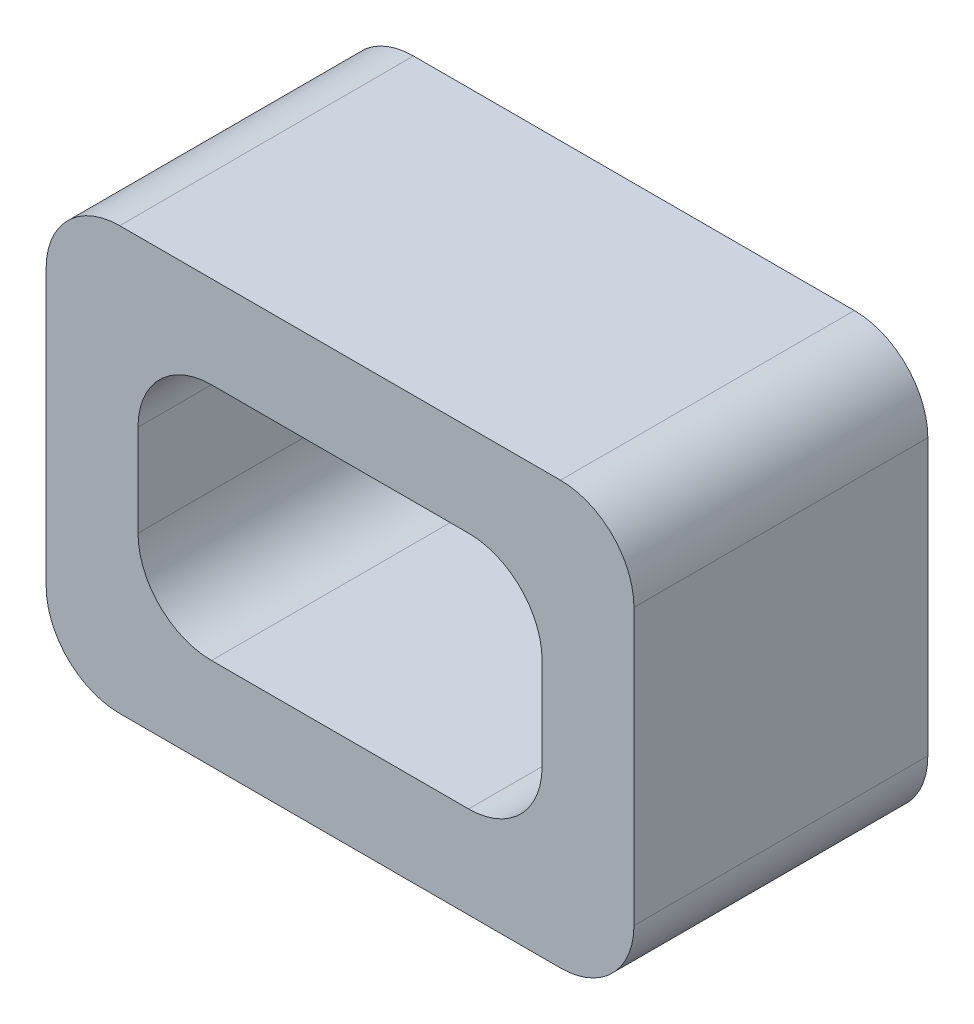
ISO-10303-21;
HEADER;
FILE_DESCRIPTION(('STEP AP214'),'2;1');
FILE_NAME('part.step','',(''),(''),'','','');
FILE_SCHEMA(('AUTOMOTIVE_DESIGN { 1 0 10303 214 1 1 1 1 }'));
ENDSEC;
DATA;
#1=APPLICATION_CONTEXT('core data for automotive mechanical design processes');
#2=APPLICATION_PROTOCOL_DEFINITION('international standard','automotive_design',2000,#1);
#3=PRODUCT_CONTEXT('',#1,'mechanical');
#4=PRODUCT('Part','Part','',(#3));
#5=PRODUCT_RELATED_PRODUCT_CATEGORY('part','',(#4));
#6=PRODUCT_DEFINITION_FORMATION('','',#4);
#7=PRODUCT_DEFINITION_CONTEXT('part definition',#1,'design');
#8=PRODUCT_DEFINITION('design','',#6,#7);
#9=PRODUCT_DEFINITION_SHAPE('','',#8);
#10=(LENGTH_UNIT() NAMED_UNIT(*) SI_UNIT(.MILLI.,.METRE.));
#11=(NAMED_UNIT(*) PLANE_ANGLE_UNIT() SI_UNIT($,.RADIAN.));
#12=(NAMED_UNIT(*) SI_UNIT($,.STERADIAN.) SOLID_ANGLE_UNIT());
#13=UNCERTAINTY_MEASURE_WITH_UNIT(LENGTH_MEASURE(1.E-05),#10,'distance_accuracy_value','');
#14=(GEOMETRIC_REPRESENTATION_CONTEXT(3) GLOBAL_UNCERTAINTY_ASSIGNED_CONTEXT((#13)) GLOBAL_UNIT_ASSIGNED_CONTEXT((#10,
#11,#12)) REPRESENTATION_CONTEXT('',''));
#15=CARTESIAN_POINT('',(0.,0.,0.));
#16=DIRECTION('',(0.,0.,1.));
#17=DIRECTION('',(1.,0.,0.));
#18=AXIS2_PLACEMENT_3D('',#15,#16,#17);
#19=CARTESIAN_POINT('',(0.,0.,0.8));
#20=DIRECTION('',(-1.,0.,0.));
#21=DIRECTION('',(0.,0.,1.));
#22=AXIS2_PLACEMENT_3D('',#19,#20,#21);
#23=PLANE('',#22);
#24=DIRECTION('',(0.,1.,0.));
#25=VECTOR('',#24,1.);
#26=CARTESIAN_POINT('',(0.,0.,0.8));
#27=LINE('',#26,#25);
#28=CARTESIAN_POINT('',(0.,0.2,0.8));
#29=VERTEX_POINT('',#28);
#30=CARTESIAN_POINT('',(0.,0.95,0.8));
#31=VERTEX_POINT('',#30);
#32=EDGE_CURVE('E174',#29,#31,#27,.T.);
#33=ORIENTED_EDGE('',*,*,#32,.F.);
#34=DIRECTION('',(0.,0.,-1.));
#35=VECTOR('',#34,1.);
#36=CARTESIAN_POINT('',(0.,0.2,0.8));
#37=LINE('',#36,#35);
#38=CARTESIAN_POINT('',(0.,0.2,0.));
#39=VERTEX_POINT('',#38);
#40=EDGE_CURVE('E206',#29,#39,#37,.T.);
#41=ORIENTED_EDGE('',*,*,#40,.T.);
#42=DIRECTION('',(0.,1.,0.));
#43=VECTOR('',#42,1.);
#44=CARTESIAN_POINT('',(0.,0.,0.));
#45=LINE('',#44,#43);
#46=CARTESIAN_POINT('',(0.,0.95,0.));
#47=VERTEX_POINT('',#46);
#48=EDGE_CURVE('E265',#39,#47,#45,.T.);
#49=ORIENTED_EDGE('',*,*,#48,.T.);
#50=DIRECTION('',(0.,0.,-1.));
#51=VECTOR('',#50,1.);
#52=CARTESIAN_POINT('',(0.,0.95,0.8));
#53=LINE('',#52,#51);
#54=EDGE_CURVE('E204',#47,#31,#53,.F.);
#55=ORIENTED_EDGE('',*,*,#54,.T.);
#56=EDGE_LOOP('',(#33,#41,#49,#55));
#57=FACE_BOUND('',#56,.T.);
#58=ADVANCED_FACE('F33',(#57),#23,.F.);
#59=CARTESIAN_POINT('',(0.,1.15,0.8));
#60=DIRECTION('',(0.,-1.,0.));
#61=DIRECTION('',(1.,0.,0.));
#62=AXIS2_PLACEMENT_3D('',#59,#60,#61);
#63=PLANE('',#62);
#64=DIRECTION('',(-1.,0.,0.));
#65=VECTOR('',#64,1.);
#66=CARTESIAN_POINT('',(0.,1.15,0.));
#67=LINE('',#66,#65);
#68=CARTESIAN_POINT('',(-0.2,1.15,0.));
#69=VERTEX_POINT('',#68);
#70=CARTESIAN_POINT('',(-1.4,1.15,0.));
#71=VERTEX_POINT('',#70);
#72=EDGE_CURVE('E180',#69,#71,#67,.T.);
#73=ORIENTED_EDGE('',*,*,#72,.T.);
#74=DIRECTION('',(0.,0.,-1.));
#75=VECTOR('',#74,1.);
#76=CARTESIAN_POINT('',(-1.4,1.15,0.8));
#77=LINE('',#76,#75);
#78=CARTESIAN_POINT('',(-1.4,1.15,0.8));
#79=VERTEX_POINT('',#78);
#80=EDGE_CURVE('E202',#71,#79,#77,.F.);
#81=ORIENTED_EDGE('',*,*,#80,.T.);
#82=DIRECTION('',(-1.,0.,0.));
#83=VECTOR('',#82,1.);
#84=CARTESIAN_POINT('',(0.,1.15,0.8));
#85=LINE('',#84,#83);
#86=CARTESIAN_POINT('',(-0.2,1.15,0.8));
#87=VERTEX_POINT('',#86);
#88=EDGE_CURVE('E178',#87,#79,#85,.T.);
#89=ORIENTED_EDGE('',*,*,#88,.F.);
#90=DIRECTION('',(0.,0.,-1.));
#91=VECTOR('',#90,1.);
#92=CARTESIAN_POINT('',(-0.2,1.15,0.8));
#93=LINE('',#92,#91);
#94=EDGE_CURVE('E199',#87,#69,#93,.T.);
#95=ORIENTED_EDGE('',*,*,#94,.T.);
#96=EDGE_LOOP('',(#73,#81,#89,#95));
#97=FACE_BOUND('',#96,.T.);
#98=ADVANCED_FACE('F288',(#97),#63,.F.);
#99=CARTESIAN_POINT('',(-1.6,0.,0.8));
#100=DIRECTION('',(1.,0.,0.));
#101=DIRECTION('',(0.,0.,-1.));
#102=AXIS2_PLACEMENT_3D('',#99,#100,#101);
#103=PLANE('',#102);
#104=DIRECTION('',(0.,-1.,0.));
#105=VECTOR('',#104,1.);
#106=CARTESIAN_POINT('',(-1.6,0.,0.));
#107=LINE('',#106,#105);
#108=CARTESIAN_POINT('',(-1.6,0.95,0.));
#109=VERTEX_POINT('',#108);
#110=CARTESIAN_POINT('',(-1.6,0.2,0.));
#111=VERTEX_POINT('',#110);
#112=EDGE_CURVE('E175',#109,#111,#107,.T.);
#113=ORIENTED_EDGE('',*,*,#112,.T.);
#114=DIRECTION('',(0.,0.,-1.));
#115=VECTOR('',#114,1.);
#116=CARTESIAN_POINT('',(-1.6,0.2,0.8));
#117=LINE('',#116,#115);
#118=CARTESIAN_POINT('',(-1.6,0.2,0.8));
#119=VERTEX_POINT('',#118);
#120=EDGE_CURVE('E152',#111,#119,#117,.F.);
#121=ORIENTED_EDGE('',*,*,#120,.T.);
#122=DIRECTION('',(0.,-1.,0.));
#123=VECTOR('',#122,1.);
#124=CARTESIAN_POINT('',(-1.6,0.,0.8));
#125=LINE('',#124,#123);
#126=CARTESIAN_POINT('',(-1.6,0.95,0.8));
#127=VERTEX_POINT('',#126);
#128=EDGE_CURVE('E279',#127,#119,#125,.T.);
#129=ORIENTED_EDGE('',*,*,#128,.F.);
#130=DIRECTION('',(0.,0.,-1.));
#131=VECTOR('',#130,1.);
#132=CARTESIAN_POINT('',(-1.6,0.95,0.8));
#133=LINE('',#132,#131);
#134=EDGE_CURVE('E157',#127,#109,#133,.T.);
#135=ORIENTED_EDGE('',*,*,#134,.T.);
#136=EDGE_LOOP('',(#113,#121,#129,#135));
#137=FACE_BOUND('',#136,.T.);
#138=ADVANCED_FACE('F297',(#137),#103,.F.);
#139=CARTESIAN_POINT('',(0.,0.,0.8));
#140=DIRECTION('',(0.,1.,0.));
#141=DIRECTION('',(0.,0.,1.));
#142=AXIS2_PLACEMENT_3D('',#139,#140,#141);
#143=PLANE('',#142);
#144=DIRECTION('',(1.,0.,0.));
#145=VECTOR('',#144,1.);
#146=CARTESIAN_POINT('',(0.,0.,0.8));
#147=LINE('',#146,#145);
#148=CARTESIAN_POINT('',(-1.4,0.,0.8));
#149=VERTEX_POINT('',#148);
#150=CARTESIAN_POINT('',(-0.2,0.,0.8));
#151=VERTEX_POINT('',#150);
#152=EDGE_CURVE('E167',#149,#151,#147,.T.);
#153=ORIENTED_EDGE('',*,*,#152,.F.);
#154=DIRECTION('',(0.,0.,-1.));
#155=VECTOR('',#154,1.);
#156=CARTESIAN_POINT('',(-1.4,0.,0.8));
#157=LINE('',#156,#155);
#158=CARTESIAN_POINT('',(-1.4,0.,0.));
#159=VERTEX_POINT('',#158);
#160=EDGE_CURVE('E151',#149,#159,#157,.T.);
#161=ORIENTED_EDGE('',*,*,#160,.T.);
#162=DIRECTION('',(1.,0.,0.));
#163=VECTOR('',#162,1.);
#164=CARTESIAN_POINT('',(0.,0.,0.));
#165=LINE('',#164,#163);
#166=CARTESIAN_POINT('',(-0.2,0.,0.));
#167=VERTEX_POINT('',#166);
#168=EDGE_CURVE('E164',#159,#167,#165,.T.);
#169=ORIENTED_EDGE('',*,*,#168,.T.);
#170=DIRECTION('',(0.,0.,-1.));
#171=VECTOR('',#170,1.);
#172=CARTESIAN_POINT('',(-0.2,0.,0.8));
#173=LINE('',#172,#171);
#174=EDGE_CURVE('E169',#167,#151,#173,.F.);
#175=ORIENTED_EDGE('',*,*,#174,.T.);
#176=EDGE_LOOP('',(#153,#161,#169,#175));
#177=FACE_BOUND('',#176,.T.);
#178=ADVANCED_FACE('F163',(#177),#143,.F.);
#179=CARTESIAN_POINT('',(0.,0.,0.8));
#180=DIRECTION('',(0.,0.,1.));
#181=DIRECTION('',(1.,0.,0.));
#182=AXIS2_PLACEMENT_3D('',#179,#180,#181);
#183=PLANE('',#182);
#184=DIRECTION('',(0.,-1.,0.));
#185=VECTOR('',#184,1.);
#186=CARTESIAN_POINT('',(-1.35,0.9,0.8));
#187=LINE('',#186,#185);
#188=CARTESIAN_POINT('',(-1.35,0.7,0.8));
#189=VERTEX_POINT('',#188);
#190=CARTESIAN_POINT('',(-1.35,0.45,0.8));
#191=VERTEX_POINT('',#190);
#192=EDGE_CURVE('E251',#189,#191,#187,.T.);
#193=ORIENTED_EDGE('',*,*,#192,.F.);
#194=CARTESIAN_POINT('',(-1.15,0.7,0.8));
#195=DIRECTION('',(0.,0.,1.));
#196=DIRECTION('',(1.,0.,0.));
#197=AXIS2_PLACEMENT_3D('',#194,#195,#196);
#198=CIRCLE('',#197,0.2);
#199=CARTESIAN_POINT('',(-1.15,0.9,0.8));
#200=VERTEX_POINT('',#199);
#201=EDGE_CURVE('E232',#189,#200,#198,.F.);
#202=ORIENTED_EDGE('',*,*,#201,.T.);
#203=DIRECTION('',(-1.,0.,0.));
#204=VECTOR('',#203,1.);
#205=CARTESIAN_POINT('',(-0.25,0.9,0.8));
#206=LINE('',#205,#204);
#207=CARTESIAN_POINT('',(-0.45,0.9,0.8));
#208=VERTEX_POINT('',#207);
#209=EDGE_CURVE('E274',#208,#200,#206,.T.);
#210=ORIENTED_EDGE('',*,*,#209,.F.);
#211=CARTESIAN_POINT('',(-0.45,0.7,0.8));
#212=DIRECTION('',(0.,0.,1.));
#213=DIRECTION('',(1.,0.,0.));
#214=AXIS2_PLACEMENT_3D('',#211,#212,#213);
#215=CIRCLE('',#214,0.2);
#216=CARTESIAN_POINT('',(-0.25,0.7,0.8));
#217=VERTEX_POINT('',#216);
#218=EDGE_CURVE('E228',#208,#217,#215,.F.);
#219=ORIENTED_EDGE('',*,*,#218,.T.);
#220=DIRECTION('',(0.,1.,0.));
#221=VECTOR('',#220,1.);
#222=CARTESIAN_POINT('',(-0.25,0.25,0.8));
#223=LINE('',#222,#221);
#224=CARTESIAN_POINT('',(-0.25,0.45,0.8));
#225=VERTEX_POINT('',#224);
#226=EDGE_CURVE('E246',#225,#217,#223,.T.);
#227=ORIENTED_EDGE('',*,*,#226,.F.);
#228=CARTESIAN_POINT('',(-0.45,0.45,0.8));
#229=DIRECTION('',(0.,0.,1.));
#230=DIRECTION('',(1.,0.,0.));
#231=AXIS2_PLACEMENT_3D('',#228,#229,#230);
#232=CIRCLE('',#231,0.2);
#233=CARTESIAN_POINT('',(-0.45,0.25,0.8));
#234=VERTEX_POINT('',#233);
#235=EDGE_CURVE('E41',#225,#234,#232,.F.);
#236=ORIENTED_EDGE('',*,*,#235,.T.);
#237=DIRECTION('',(1.,0.,0.));
#238=VECTOR('',#237,1.);
#239=CARTESIAN_POINT('',(-1.35,0.25,0.8));
#240=LINE('',#239,#238);
#241=CARTESIAN_POINT('',(-1.15,0.25,0.8));
#242=VERTEX_POINT('',#241);
#243=EDGE_CURVE('E244',#242,#234,#240,.T.);
#244=ORIENTED_EDGE('',*,*,#243,.F.);
#245=CARTESIAN_POINT('',(-1.15,0.45,0.8));
#246=DIRECTION('',(0.,0.,1.));
#247=DIRECTION('',(1.,0.,0.));
#248=AXIS2_PLACEMENT_3D('',#245,#246,#247);
#249=CIRCLE('',#248,0.2);
#250=EDGE_CURVE('E236',#242,#191,#249,.F.);
#251=ORIENTED_EDGE('',*,*,#250,.T.);
#252=EDGE_LOOP('',(#193,#202,#210,#219,#227,#236,#244,#251));
#253=FACE_BOUND('',#252,.T.);
#254=ORIENTED_EDGE('',*,*,#128,.T.);
#255=CARTESIAN_POINT('',(-1.4,0.2,0.8));
#256=DIRECTION('',(0.,0.,1.));
#257=DIRECTION('',(1.,0.,0.));
#258=AXIS2_PLACEMENT_3D('',#255,#256,#257);
#259=CIRCLE('',#258,0.2);
#260=EDGE_CURVE('E197',#119,#149,#259,.T.);
#261=ORIENTED_EDGE('',*,*,#260,.T.);
#262=ORIENTED_EDGE('',*,*,#152,.T.);
#263=CARTESIAN_POINT('',(-0.2,0.2,0.8));
#264=DIRECTION('',(0.,0.,1.));
#265=DIRECTION('',(1.,0.,0.));
#266=AXIS2_PLACEMENT_3D('',#263,#264,#265);
#267=CIRCLE('',#266,0.2);
#268=EDGE_CURVE('E193',#151,#29,#267,.T.);
#269=ORIENTED_EDGE('',*,*,#268,.T.);
#270=ORIENTED_EDGE('',*,*,#32,.T.);
#271=CARTESIAN_POINT('',(-0.2,0.95,0.8));
#272=DIRECTION('',(0.,0.,1.));
#273=DIRECTION('',(1.,0.,0.));
#274=AXIS2_PLACEMENT_3D('',#271,#272,#273);
#275=CIRCLE('',#274,0.2);
#276=EDGE_CURVE('E191',#31,#87,#275,.T.);
#277=ORIENTED_EDGE('',*,*,#276,.T.);
#278=ORIENTED_EDGE('',*,*,#88,.T.);
#279=CARTESIAN_POINT('',(-1.4,0.95,0.8));
#280=DIRECTION('',(0.,0.,1.));
#281=DIRECTION('',(1.,0.,0.));
#282=AXIS2_PLACEMENT_3D('',#279,#280,#281);
#283=CIRCLE('',#282,0.2);
#284=EDGE_CURVE('E195',#79,#127,#283,.T.);
#285=ORIENTED_EDGE('',*,*,#284,.T.);
#286=EDGE_LOOP('',(#254,#261,#262,#269,#270,#277,#278,#285));
#287=FACE_BOUND('',#286,.T.);
#288=ADVANCED_FACE('F242',(#253,#287),#183,.T.);
#289=CARTESIAN_POINT('',(0.,0.,0.));
#290=DIRECTION('',(0.,0.,1.));
#291=DIRECTION('',(1.,0.,0.));
#292=AXIS2_PLACEMENT_3D('',#289,#290,#291);
#293=PLANE('',#292);
#294=DIRECTION('',(0.,1.,0.));
#295=VECTOR('',#294,1.);
#296=CARTESIAN_POINT('',(-0.25,0.25,0.));
#297=LINE('',#296,#295);
#298=CARTESIAN_POINT('',(-0.25,0.45,0.));
#299=VERTEX_POINT('',#298);
#300=CARTESIAN_POINT('',(-0.25,0.7,0.));
#301=VERTEX_POINT('',#300);
#302=EDGE_CURVE('E256',#299,#301,#297,.T.);
#303=ORIENTED_EDGE('',*,*,#302,.T.);
#304=CARTESIAN_POINT('',(-0.45,0.7,0.));
#305=DIRECTION('',(0.,0.,1.));
#306=DIRECTION('',(1.,0.,0.));
#307=AXIS2_PLACEMENT_3D('',#304,#305,#306);
#308=CIRCLE('',#307,0.2);
#309=CARTESIAN_POINT('',(-0.45,0.9,0.));
#310=VERTEX_POINT('',#309);
#311=EDGE_CURVE('E230',#301,#310,#308,.T.);
#312=ORIENTED_EDGE('',*,*,#311,.T.);
#313=DIRECTION('',(-1.,0.,0.));
#314=VECTOR('',#313,1.);
#315=CARTESIAN_POINT('',(-0.25,0.9,0.));
#316=LINE('',#315,#314);
#317=CARTESIAN_POINT('',(-1.15,0.9,0.));
#318=VERTEX_POINT('',#317);
#319=EDGE_CURVE('E262',#310,#318,#316,.T.);
#320=ORIENTED_EDGE('',*,*,#319,.T.);
#321=CARTESIAN_POINT('',(-1.15,0.7,0.));
#322=DIRECTION('',(0.,0.,1.));
#323=DIRECTION('',(1.,0.,0.));
#324=AXIS2_PLACEMENT_3D('',#321,#322,#323);
#325=CIRCLE('',#324,0.2);
#326=CARTESIAN_POINT('',(-1.35,0.7,0.));
#327=VERTEX_POINT('',#326);
#328=EDGE_CURVE('E234',#318,#327,#325,.T.);
#329=ORIENTED_EDGE('',*,*,#328,.T.);
#330=DIRECTION('',(0.,-1.,0.));
#331=VECTOR('',#330,1.);
#332=CARTESIAN_POINT('',(-1.35,0.9,0.));
#333=LINE('',#332,#331);
#334=CARTESIAN_POINT('',(-1.35,0.45,0.));
#335=VERTEX_POINT('',#334);
#336=EDGE_CURVE('E267',#327,#335,#333,.T.);
#337=ORIENTED_EDGE('',*,*,#336,.T.);
#338=CARTESIAN_POINT('',(-1.15,0.45,0.));
#339=DIRECTION('',(0.,0.,1.));
#340=DIRECTION('',(1.,0.,0.));
#341=AXIS2_PLACEMENT_3D('',#338,#339,#340);
#342=CIRCLE('',#341,0.2);
#343=CARTESIAN_POINT('',(-1.15,0.25,0.));
#344=VERTEX_POINT('',#343);
#345=EDGE_CURVE('E55',#335,#344,#342,.T.);
#346=ORIENTED_EDGE('',*,*,#345,.T.);
#347=DIRECTION('',(1.,0.,0.));
#348=VECTOR('',#347,1.);
#349=CARTESIAN_POINT('',(-1.35,0.25,0.));
#350=LINE('',#349,#348);
#351=CARTESIAN_POINT('',(-0.45,0.25,0.));
#352=VERTEX_POINT('',#351);
#353=EDGE_CURVE('E258',#344,#352,#350,.T.);
#354=ORIENTED_EDGE('',*,*,#353,.T.);
#355=CARTESIAN_POINT('',(-0.45,0.45,0.));
#356=DIRECTION('',(0.,0.,1.));
#357=DIRECTION('',(1.,0.,0.));
#358=AXIS2_PLACEMENT_3D('',#355,#356,#357);
#359=CIRCLE('',#358,0.2);
#360=EDGE_CURVE('E11',#352,#299,#359,.T.);
#361=ORIENTED_EDGE('',*,*,#360,.T.);
#362=EDGE_LOOP('',(#303,#312,#320,#329,#337,#346,#354,#361));
#363=FACE_BOUND('',#362,.T.);
#364=ORIENTED_EDGE('',*,*,#168,.F.);
#365=CARTESIAN_POINT('',(-1.4,0.2,0.));
#366=DIRECTION('',(0.,0.,1.));
#367=DIRECTION('',(1.,0.,0.));
#368=AXIS2_PLACEMENT_3D('',#365,#366,#367);
#369=CIRCLE('',#368,0.2);
#370=EDGE_CURVE('E147',#159,#111,#369,.F.);
#371=ORIENTED_EDGE('',*,*,#370,.T.);
#372=ORIENTED_EDGE('',*,*,#112,.F.);
#373=CARTESIAN_POINT('',(-1.4,0.95,0.));
#374=DIRECTION('',(0.,0.,1.));
#375=DIRECTION('',(1.,0.,0.));
#376=AXIS2_PLACEMENT_3D('',#373,#374,#375);
#377=CIRCLE('',#376,0.2);
#378=EDGE_CURVE('E158',#109,#71,#377,.F.);
#379=ORIENTED_EDGE('',*,*,#378,.T.);
#380=ORIENTED_EDGE('',*,*,#72,.F.);
#381=CARTESIAN_POINT('',(-0.2,0.95,0.));
#382=DIRECTION('',(0.,0.,1.));
#383=DIRECTION('',(1.,0.,0.));
#384=AXIS2_PLACEMENT_3D('',#381,#382,#383);
#385=CIRCLE('',#384,0.2);
#386=EDGE_CURVE('E168',#69,#47,#385,.F.);
#387=ORIENTED_EDGE('',*,*,#386,.T.);
#388=ORIENTED_EDGE('',*,*,#48,.F.);
#389=CARTESIAN_POINT('',(-0.2,0.2,0.));
#390=DIRECTION('',(0.,0.,1.));
#391=DIRECTION('',(1.,0.,0.));
#392=AXIS2_PLACEMENT_3D('',#389,#390,#391);
#393=CIRCLE('',#392,0.2);
#394=EDGE_CURVE('E173',#39,#167,#393,.F.);
#395=ORIENTED_EDGE('',*,*,#394,.T.);
#396=EDGE_LOOP('',(#364,#371,#372,#379,#380,#387,#388,#395));
#397=FACE_BOUND('',#396,.T.);
#398=ADVANCED_FACE('F171',(#363,#397),#293,.F.);
#399=CARTESIAN_POINT('',(-1.4,0.2,0.8));
#400=DIRECTION('',(0.,0.,-1.));
#401=DIRECTION('',(-1.,0.,0.));
#402=AXIS2_PLACEMENT_3D('',#399,#400,#401);
#403=CYLINDRICAL_SURFACE('',#402,0.2);
#404=ORIENTED_EDGE('',*,*,#260,.F.);
#405=ORIENTED_EDGE('',*,*,#120,.F.);
#406=ORIENTED_EDGE('',*,*,#370,.F.);
#407=ORIENTED_EDGE('',*,*,#160,.F.);
#408=EDGE_LOOP('',(#404,#405,#406,#407));
#409=FACE_BOUND('',#408,.T.);
#410=ADVANCED_FACE('F150',(#409),#403,.T.);
#411=CARTESIAN_POINT('',(-1.4,0.95,0.8));
#412=DIRECTION('',(0.,0.,-1.));
#413=DIRECTION('',(-1.,0.,0.));
#414=AXIS2_PLACEMENT_3D('',#411,#412,#413);
#415=CYLINDRICAL_SURFACE('',#414,0.2);
#416=ORIENTED_EDGE('',*,*,#284,.F.);
#417=ORIENTED_EDGE('',*,*,#80,.F.);
#418=ORIENTED_EDGE('',*,*,#378,.F.);
#419=ORIENTED_EDGE('',*,*,#134,.F.);
#420=EDGE_LOOP('',(#416,#417,#418,#419));
#421=FACE_BOUND('',#420,.T.);
#422=ADVANCED_FACE('F293',(#421),#415,.T.);
#423=CARTESIAN_POINT('',(-0.2,0.2,0.8));
#424=DIRECTION('',(0.,0.,-1.));
#425=DIRECTION('',(-1.,0.,0.));
#426=AXIS2_PLACEMENT_3D('',#423,#424,#425);
#427=CYLINDRICAL_SURFACE('',#426,0.2);
#428=ORIENTED_EDGE('',*,*,#268,.F.);
#429=ORIENTED_EDGE('',*,*,#174,.F.);
#430=ORIENTED_EDGE('',*,*,#394,.F.);
#431=ORIENTED_EDGE('',*,*,#40,.F.);
#432=EDGE_LOOP('',(#428,#429,#430,#431));
#433=FACE_BOUND('',#432,.T.);
#434=ADVANCED_FACE('F317',(#433),#427,.T.);
#435=CARTESIAN_POINT('',(-0.2,0.95,0.8));
#436=DIRECTION('',(0.,0.,-1.));
#437=DIRECTION('',(-1.,0.,0.));
#438=AXIS2_PLACEMENT_3D('',#435,#436,#437);
#439=CYLINDRICAL_SURFACE('',#438,0.2);
#440=ORIENTED_EDGE('',*,*,#276,.F.);
#441=ORIENTED_EDGE('',*,*,#54,.F.);
#442=ORIENTED_EDGE('',*,*,#386,.F.);
#443=ORIENTED_EDGE('',*,*,#94,.F.);
#444=EDGE_LOOP('',(#440,#441,#442,#443));
#445=FACE_BOUND('',#444,.T.);
#446=ADVANCED_FACE('F320',(#445),#439,.T.);
#447=CARTESIAN_POINT('',(-1.35,0.9,0.));
#448=DIRECTION('',(-1.,0.,0.));
#449=DIRECTION('',(0.,0.,1.));
#450=AXIS2_PLACEMENT_3D('',#447,#448,#449);
#451=PLANE('',#450);
#452=ORIENTED_EDGE('',*,*,#336,.F.);
#453=DIRECTION('',(0.,0.,1.));
#454=VECTOR('',#453,1.);
#455=CARTESIAN_POINT('',(-1.35,0.7,0.8));
#456=LINE('',#455,#454);
#457=EDGE_CURVE('E221',#327,#189,#456,.T.);
#458=ORIENTED_EDGE('',*,*,#457,.T.);
#459=ORIENTED_EDGE('',*,*,#192,.T.);
#460=DIRECTION('',(0.,0.,1.));
#461=VECTOR('',#460,1.);
#462=CARTESIAN_POINT('',(-1.35,0.45,0.));
#463=LINE('',#462,#461);
#464=EDGE_CURVE('E219',#191,#335,#463,.F.);
#465=ORIENTED_EDGE('',*,*,#464,.T.);
#466=EDGE_LOOP('',(#452,#458,#459,#465));
#467=FACE_BOUND('',#466,.T.);
#468=ADVANCED_FACE('F324',(#467),#451,.F.);
#469=CARTESIAN_POINT('',(-0.25,0.9,0.));
#470=DIRECTION('',(0.,1.,0.));
#471=DIRECTION('',(-1.,0.,0.));
#472=AXIS2_PLACEMENT_3D('',#469,#470,#471);
#473=PLANE('',#472);
#474=ORIENTED_EDGE('',*,*,#319,.F.);
#475=DIRECTION('',(0.,0.,1.));
#476=VECTOR('',#475,1.);
#477=CARTESIAN_POINT('',(-0.45,0.9,0.8));
#478=LINE('',#477,#476);
#479=EDGE_CURVE('E211',#310,#208,#478,.T.);
#480=ORIENTED_EDGE('',*,*,#479,.T.);
#481=ORIENTED_EDGE('',*,*,#209,.T.);
#482=DIRECTION('',(0.,0.,1.));
#483=VECTOR('',#482,1.);
#484=CARTESIAN_POINT('',(-1.15,0.9,0.));
#485=LINE('',#484,#483);
#486=EDGE_CURVE('E209',#200,#318,#485,.F.);
#487=ORIENTED_EDGE('',*,*,#486,.T.);
#488=EDGE_LOOP('',(#474,#480,#481,#487));
#489=FACE_BOUND('',#488,.T.);
#490=ADVANCED_FACE('F348',(#489),#473,.F.);
#491=CARTESIAN_POINT('',(-0.25,0.25,0.));
#492=DIRECTION('',(1.,0.,0.));
#493=DIRECTION('',(0.,0.,-1.));
#494=AXIS2_PLACEMENT_3D('',#491,#492,#493);
#495=PLANE('',#494);
#496=ORIENTED_EDGE('',*,*,#226,.T.);
#497=DIRECTION('',(0.,0.,1.));
#498=VECTOR('',#497,1.);
#499=CARTESIAN_POINT('',(-0.25,0.7,0.));
#500=LINE('',#499,#498);
#501=EDGE_CURVE('E217',#217,#301,#500,.F.);
#502=ORIENTED_EDGE('',*,*,#501,.T.);
#503=ORIENTED_EDGE('',*,*,#302,.F.);
#504=DIRECTION('',(0.,0.,1.));
#505=VECTOR('',#504,1.);
#506=CARTESIAN_POINT('',(-0.25,0.45,0.8));
#507=LINE('',#506,#505);
#508=EDGE_CURVE('E214',#299,#225,#507,.T.);
#509=ORIENTED_EDGE('',*,*,#508,.T.);
#510=EDGE_LOOP('',(#496,#502,#503,#509));
#511=FACE_BOUND('',#510,.T.);
#512=ADVANCED_FACE('F260',(#511),#495,.F.);
#513=CARTESIAN_POINT('',(-1.35,0.25,0.));
#514=DIRECTION('',(0.,-1.,0.));
#515=DIRECTION('',(0.,0.,-1.));
#516=AXIS2_PLACEMENT_3D('',#513,#514,#515);
#517=PLANE('',#516);
#518=ORIENTED_EDGE('',*,*,#353,.F.);
#519=DIRECTION('',(0.,0.,1.));
#520=VECTOR('',#519,1.);
#521=CARTESIAN_POINT('',(-1.15,0.25,0.8));
#522=LINE('',#521,#520);
#523=EDGE_CURVE('E225',#344,#242,#522,.T.);
#524=ORIENTED_EDGE('',*,*,#523,.T.);
#525=ORIENTED_EDGE('',*,*,#243,.T.);
#526=DIRECTION('',(0.,0.,1.));
#527=VECTOR('',#526,1.);
#528=CARTESIAN_POINT('',(-0.45,0.25,0.));
#529=LINE('',#528,#527);
#530=EDGE_CURVE('E48',#234,#352,#529,.F.);
#531=ORIENTED_EDGE('',*,*,#530,.T.);
#532=EDGE_LOOP('',(#518,#524,#525,#531));
#533=FACE_BOUND('',#532,.T.);
#534=ADVANCED_FACE('F249',(#533),#517,.F.);
#535=CARTESIAN_POINT('',(-0.45,0.7,0.));
#536=DIRECTION('',(0.,0.,-1.));
#537=DIRECTION('',(-1.,0.,0.));
#538=AXIS2_PLACEMENT_3D('',#535,#536,#537);
#539=CYLINDRICAL_SURFACE('',#538,0.2);
#540=ORIENTED_EDGE('',*,*,#311,.F.);
#541=ORIENTED_EDGE('',*,*,#501,.F.);
#542=ORIENTED_EDGE('',*,*,#218,.F.);
#543=ORIENTED_EDGE('',*,*,#479,.F.);
#544=EDGE_LOOP('',(#540,#541,#542,#543));
#545=FACE_BOUND('',#544,.T.);
#546=ADVANCED_FACE('F326',(#545),#539,.F.);
#547=CARTESIAN_POINT('',(-1.15,0.7,0.));
#548=DIRECTION('',(0.,0.,-1.));
#549=DIRECTION('',(-1.,0.,0.));
#550=AXIS2_PLACEMENT_3D('',#547,#548,#549);
#551=CYLINDRICAL_SURFACE('',#550,0.2);
#552=ORIENTED_EDGE('',*,*,#328,.F.);
#553=ORIENTED_EDGE('',*,*,#486,.F.);
#554=ORIENTED_EDGE('',*,*,#201,.F.);
#555=ORIENTED_EDGE('',*,*,#457,.F.);
#556=EDGE_LOOP('',(#552,#553,#554,#555));
#557=FACE_BOUND('',#556,.T.);
#558=ADVANCED_FACE('F329',(#557),#551,.F.);
#559=CARTESIAN_POINT('',(-1.15,0.45,0.));
#560=DIRECTION('',(0.,0.,-1.));
#561=DIRECTION('',(-1.,0.,0.));
#562=AXIS2_PLACEMENT_3D('',#559,#560,#561);
#563=CYLINDRICAL_SURFACE('',#562,0.2);
#564=ORIENTED_EDGE('',*,*,#345,.F.);
#565=ORIENTED_EDGE('',*,*,#464,.F.);
#566=ORIENTED_EDGE('',*,*,#250,.F.);
#567=ORIENTED_EDGE('',*,*,#523,.F.);
#568=EDGE_LOOP('',(#564,#565,#566,#567));
#569=FACE_BOUND('',#568,.T.);
#570=ADVANCED_FACE('F332',(#569),#563,.F.);
#571=CARTESIAN_POINT('',(-0.45,0.45,0.));
#572=DIRECTION('',(0.,0.,-1.));
#573=DIRECTION('',(-1.,0.,0.));
#574=AXIS2_PLACEMENT_3D('',#571,#572,#573);
#575=CYLINDRICAL_SURFACE('',#574,0.2);
#576=ORIENTED_EDGE('',*,*,#360,.F.);
#577=ORIENTED_EDGE('',*,*,#530,.F.);
#578=ORIENTED_EDGE('',*,*,#235,.F.);
#579=ORIENTED_EDGE('',*,*,#508,.F.);
#580=EDGE_LOOP('',(#576,#577,#578,#579));
#581=FACE_BOUND('',#580,.T.);
#582=ADVANCED_FACE('F35',(#581),#575,.F.);
#583=CLOSED_SHELL('',(#58,#98,#138,#178,#288,#398,#410,#422,#434,#446,#468,#490,#512,#534,#546,
#558,#570,#582));
#584=MANIFOLD_SOLID_BREP('B2',#583);
#585=ADVANCED_BREP_SHAPE_REPRESENTATION('',(#18,#584),#14);
#586=SHAPE_DEFINITION_REPRESENTATION(#9,#585);
ENDSEC;
END-ISO-10303-21;
